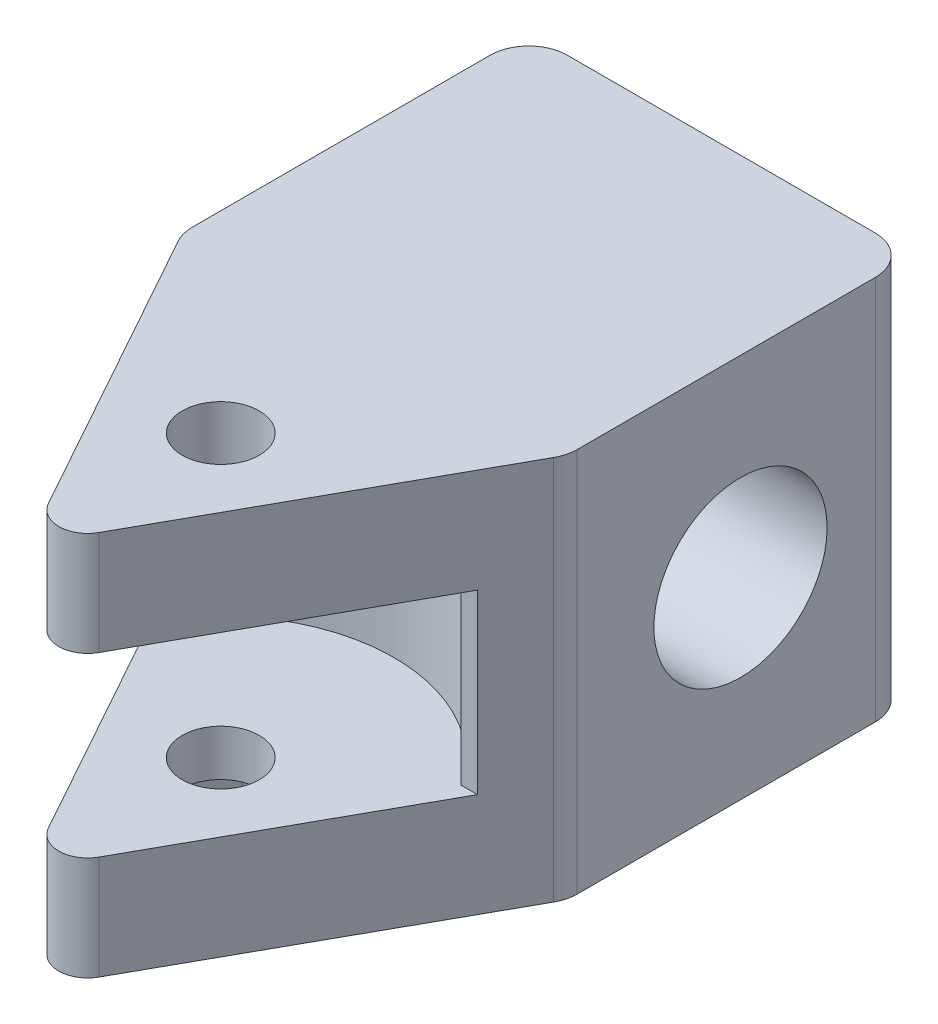
ISO-10303-21;
HEADER;
FILE_DESCRIPTION(('STEP AP214'),'2;1');
FILE_NAME('part.step','',(''),(''),'','','');
FILE_SCHEMA(('AUTOMOTIVE_DESIGN { 1 0 10303 214 1 1 1 1 }'));
ENDSEC;
DATA;
#1=APPLICATION_CONTEXT('core data for automotive mechanical design processes');
#2=APPLICATION_PROTOCOL_DEFINITION('international standard','automotive_design',2000,#1);
#3=PRODUCT_CONTEXT('',#1,'mechanical');
#4=PRODUCT('Part','Part','',(#3));
#5=PRODUCT_RELATED_PRODUCT_CATEGORY('part','',(#4));
#6=PRODUCT_DEFINITION_FORMATION('','',#4);
#7=PRODUCT_DEFINITION_CONTEXT('part definition',#1,'design');
#8=PRODUCT_DEFINITION('design','',#6,#7);
#9=PRODUCT_DEFINITION_SHAPE('','',#8);
#10=(LENGTH_UNIT() NAMED_UNIT(*) SI_UNIT(.MILLI.,.METRE.));
#11=(NAMED_UNIT(*) PLANE_ANGLE_UNIT() SI_UNIT($,.RADIAN.));
#12=(NAMED_UNIT(*) SI_UNIT($,.STERADIAN.) SOLID_ANGLE_UNIT());
#13=UNCERTAINTY_MEASURE_WITH_UNIT(LENGTH_MEASURE(1.E-05),#10,'distance_accuracy_value','');
#14=(GEOMETRIC_REPRESENTATION_CONTEXT(3) GLOBAL_UNCERTAINTY_ASSIGNED_CONTEXT((#13)) GLOBAL_UNIT_ASSIGNED_CONTEXT((#10,
#11,#12)) REPRESENTATION_CONTEXT('',''));
#15=CARTESIAN_POINT('',(0.,0.,0.));
#16=DIRECTION('',(0.,0.,1.));
#17=DIRECTION('',(1.,0.,0.));
#18=AXIS2_PLACEMENT_3D('',#15,#16,#17);
#19=CARTESIAN_POINT('',(0.,10.,17.));
#20=DIRECTION('',(0.,-1.,0.));
#21=DIRECTION('',(0.,0.,-1.));
#22=AXIS2_PLACEMENT_3D('',#19,#20,#21);
#23=CYLINDRICAL_SURFACE('',#22,2.);
#24=CARTESIAN_POINT('',(0.,-4.6,17.));
#25=DIRECTION('',(0.,-1.,0.));
#26=DIRECTION('',(0.,0.,-1.));
#27=AXIS2_PLACEMENT_3D('',#24,#25,#26);
#28=CIRCLE('',#27,2.);
#29=CARTESIAN_POINT('',(0.,-4.6,15.));
#30=VERTEX_POINT('',#29);
#31=EDGE_CURVE('E340',#30,#30,#28,.T.);
#32=ORIENTED_EDGE('',*,*,#31,.F.);
#33=EDGE_LOOP('',(#32));
#34=FACE_BOUND('',#33,.T.);
#35=CARTESIAN_POINT('',(0.,-7.,17.));
#36=DIRECTION('',(0.,-1.,0.));
#37=DIRECTION('',(0.,0.,-1.));
#38=AXIS2_PLACEMENT_3D('',#35,#36,#37);
#39=CIRCLE('',#38,2.);
#40=CARTESIAN_POINT('',(0.,-7.,15.));
#41=VERTEX_POINT('',#40);
#42=EDGE_CURVE('E41',#41,#41,#39,.T.);
#43=ORIENTED_EDGE('',*,*,#42,.T.);
#44=EDGE_LOOP('',(#43));
#45=FACE_BOUND('',#44,.T.);
#46=ADVANCED_FACE('F37',(#34,#45),#23,.F.);
#47=CARTESIAN_POINT('',(-10.,-4.6,12.));
#48=DIRECTION('',(0.,0.,-1.));
#49=DIRECTION('',(0.,1.,0.));
#50=AXIS2_PLACEMENT_3D('',#47,#48,#49);
#51=PLANE('',#50);
#52=DIRECTION('',(1.,0.,0.));
#53=VECTOR('',#52,1.);
#54=CARTESIAN_POINT('',(-10.,-4.6,12.));
#55=LINE('',#54,#53);
#56=CARTESIAN_POINT('',(-8.33333333333333,-4.6,12.));
#57=VERTEX_POINT('',#56);
#58=CARTESIAN_POINT('',(-7.48331477354788,-4.6,12.));
#59=VERTEX_POINT('',#58);
#60=EDGE_CURVE('E342',#57,#59,#55,.T.);
#61=ORIENTED_EDGE('',*,*,#60,.T.);
#62=DIRECTION('',(0.,1.,0.));
#63=VECTOR('',#62,1.);
#64=CARTESIAN_POINT('',(-7.48331477354788,-30.0558441227157,12.));
#65=LINE('',#64,#63);
#66=CARTESIAN_POINT('',(-7.48331477354788,4.6,12.));
#67=VERTEX_POINT('',#66);
#68=EDGE_CURVE('E328',#59,#67,#65,.T.);
#69=ORIENTED_EDGE('',*,*,#68,.T.);
#70=DIRECTION('',(1.,0.,0.));
#71=VECTOR('',#70,1.);
#72=CARTESIAN_POINT('',(-10.,4.6,12.));
#73=LINE('',#72,#71);
#74=CARTESIAN_POINT('',(-8.33333333333333,4.6,12.));
#75=VERTEX_POINT('',#74);
#76=EDGE_CURVE('E338',#75,#67,#73,.T.);
#77=ORIENTED_EDGE('',*,*,#76,.F.);
#78=DIRECTION('',(0.,1.,0.));
#79=VECTOR('',#78,1.);
#80=CARTESIAN_POINT('',(-8.33333333333333,10.,12.));
#81=LINE('',#80,#79);
#82=EDGE_CURVE('E354',#57,#75,#81,.T.);
#83=ORIENTED_EDGE('',*,*,#82,.F.);
#84=EDGE_LOOP('',(#61,#69,#77,#83));
#85=FACE_BOUND('',#84,.T.);
#86=ADVANCED_FACE('F474',(#85),#51,.F.);
#87=CARTESIAN_POINT('',(0.,4.6,17.));
#88=DIRECTION('',(0.,1.,0.));
#89=DIRECTION('',(0.,0.,1.));
#90=AXIS2_PLACEMENT_3D('',#87,#88,#89);
#91=CIRCLE('',#90,2.);
#92=CARTESIAN_POINT('',(0.,4.6,19.));
#93=VERTEX_POINT('',#92);
#94=EDGE_CURVE('E349',#93,#93,#91,.T.);
#95=ORIENTED_EDGE('',*,*,#94,.F.);
#96=EDGE_LOOP('',(#95));
#97=FACE_BOUND('',#96,.T.);
#98=CARTESIAN_POINT('',(0.,10.,17.));
#99=DIRECTION('',(0.,1.,0.));
#100=DIRECTION('',(0.,0.,1.));
#101=AXIS2_PLACEMENT_3D('',#98,#99,#100);
#102=CIRCLE('',#101,2.);
#103=CARTESIAN_POINT('',(0.,10.,19.));
#104=VERTEX_POINT('',#103);
#105=EDGE_CURVE('E373',#104,#104,#102,.T.);
#106=ORIENTED_EDGE('',*,*,#105,.T.);
#107=EDGE_LOOP('',(#106));
#108=FACE_BOUND('',#107,.T.);
#109=ADVANCED_FACE('F527',(#97,#108),#23,.F.);
#110=CARTESIAN_POINT('',(10.,10.,0.));
#111=DIRECTION('',(1.,0.,0.));
#112=DIRECTION('',(0.,0.,-1.));
#113=AXIS2_PLACEMENT_3D('',#110,#111,#112);
#114=PLANE('',#113);
#115=CARTESIAN_POINT('',(10.,0.,0.));
#116=DIRECTION('',(1.,0.,0.));
#117=DIRECTION('',(0.,0.,-1.));
#118=AXIS2_PLACEMENT_3D('',#115,#116,#117);
#119=CIRCLE('',#118,4.5);
#120=CARTESIAN_POINT('',(10.,0.,-4.5));
#121=VERTEX_POINT('',#120);
#122=EDGE_CURVE('E331',#121,#121,#119,.T.);
#123=ORIENTED_EDGE('',*,*,#122,.F.);
#124=EDGE_LOOP('',(#123));
#125=FACE_BOUND('',#124,.T.);
#126=DIRECTION('',(0.,0.,1.));
#127=VECTOR('',#126,1.);
#128=CARTESIAN_POINT('',(10.,-10.,0.));
#129=LINE('',#128,#127);
#130=CARTESIAN_POINT('',(10.,-10.,-7.));
#131=VERTEX_POINT('',#130);
#132=CARTESIAN_POINT('',(10.,-10.,8.4817479436052));
#133=VERTEX_POINT('',#132);
#134=EDGE_CURVE('E357',#131,#133,#129,.T.);
#135=ORIENTED_EDGE('',*,*,#134,.F.);
#136=DIRECTION('',(0.,-1.,0.));
#137=VECTOR('',#136,1.);
#138=CARTESIAN_POINT('',(10.,10.,-7.));
#139=LINE('',#138,#137);
#140=CARTESIAN_POINT('',(10.,10.,-7.));
#141=VERTEX_POINT('',#140);
#142=EDGE_CURVE('E433',#131,#141,#139,.F.);
#143=ORIENTED_EDGE('',*,*,#142,.T.);
#144=DIRECTION('',(0.,0.,1.));
#145=VECTOR('',#144,1.);
#146=CARTESIAN_POINT('',(10.,10.,0.));
#147=LINE('',#146,#145);
#148=CARTESIAN_POINT('',(10.,10.,8.4817479436052));
#149=VERTEX_POINT('',#148);
#150=EDGE_CURVE('E358',#141,#149,#147,.T.);
#151=ORIENTED_EDGE('',*,*,#150,.T.);
#152=DIRECTION('',(0.,-1.,0.));
#153=VECTOR('',#152,1.);
#154=CARTESIAN_POINT('',(10.,-10.,8.4817479436052));
#155=LINE('',#154,#153);
#156=EDGE_CURVE('E430',#149,#133,#155,.T.);
#157=ORIENTED_EDGE('',*,*,#156,.T.);
#158=EDGE_LOOP('',(#135,#143,#151,#157));
#159=FACE_BOUND('',#158,.T.);
#160=ADVANCED_FACE('F498',(#125,#159),#114,.T.);
#161=CARTESIAN_POINT('',(0.,10.,-9.));
#162=DIRECTION('',(0.,0.,-1.));
#163=DIRECTION('',(-1.,0.,0.));
#164=AXIS2_PLACEMENT_3D('',#161,#162,#163);
#165=PLANE('',#164);
#166=DIRECTION('',(1.,0.,0.));
#167=VECTOR('',#166,1.);
#168=CARTESIAN_POINT('',(0.,10.,-9.));
#169=LINE('',#168,#167);
#170=CARTESIAN_POINT('',(-8.,10.,-9.));
#171=VERTEX_POINT('',#170);
#172=CARTESIAN_POINT('',(8.,10.,-9.));
#173=VERTEX_POINT('',#172);
#174=EDGE_CURVE('E361',#171,#173,#169,.T.);
#175=ORIENTED_EDGE('',*,*,#174,.T.);
#176=DIRECTION('',(0.,-1.,0.));
#177=VECTOR('',#176,1.);
#178=CARTESIAN_POINT('',(8.,10.,-9.));
#179=LINE('',#178,#177);
#180=CARTESIAN_POINT('',(8.,-10.,-9.));
#181=VERTEX_POINT('',#180);
#182=EDGE_CURVE('E419',#173,#181,#179,.T.);
#183=ORIENTED_EDGE('',*,*,#182,.T.);
#184=DIRECTION('',(1.,0.,0.));
#185=VECTOR('',#184,1.);
#186=CARTESIAN_POINT('',(0.,-10.,-9.));
#187=LINE('',#186,#185);
#188=CARTESIAN_POINT('',(-8.,-10.,-9.));
#189=VERTEX_POINT('',#188);
#190=EDGE_CURVE('E379',#189,#181,#187,.T.);
#191=ORIENTED_EDGE('',*,*,#190,.F.);
#192=DIRECTION('',(0.,-1.,0.));
#193=VECTOR('',#192,1.);
#194=CARTESIAN_POINT('',(-8.,10.,-9.));
#195=LINE('',#194,#193);
#196=EDGE_CURVE('E417',#189,#171,#195,.F.);
#197=ORIENTED_EDGE('',*,*,#196,.T.);
#198=EDGE_LOOP('',(#175,#183,#191,#197));
#199=FACE_BOUND('',#198,.T.);
#200=ADVANCED_FACE('F506',(#199),#165,.T.);
#201=CARTESIAN_POINT('',(-10.,10.,0.));
#202=DIRECTION('',(1.,0.,0.));
#203=DIRECTION('',(0.,0.,-1.));
#204=AXIS2_PLACEMENT_3D('',#201,#202,#203);
#205=PLANE('',#204);
#206=CARTESIAN_POINT('',(-10.,0.,0.));
#207=DIRECTION('',(1.,0.,0.));
#208=DIRECTION('',(0.,0.,-1.));
#209=AXIS2_PLACEMENT_3D('',#206,#207,#208);
#210=CIRCLE('',#209,4.5);
#211=CARTESIAN_POINT('',(-10.,0.,-4.5));
#212=VERTEX_POINT('',#211);
#213=EDGE_CURVE('E334',#212,#212,#210,.F.);
#214=ORIENTED_EDGE('',*,*,#213,.F.);
#215=EDGE_LOOP('',(#214));
#216=FACE_BOUND('',#215,.T.);
#217=DIRECTION('',(0.,0.,1.));
#218=VECTOR('',#217,1.);
#219=CARTESIAN_POINT('',(-10.,10.,0.));
#220=LINE('',#219,#218);
#221=CARTESIAN_POINT('',(-10.,10.,-7.));
#222=VERTEX_POINT('',#221);
#223=CARTESIAN_POINT('',(-10.,10.,8.4817479436052));
#224=VERTEX_POINT('',#223);
#225=EDGE_CURVE('E365',#222,#224,#220,.T.);
#226=ORIENTED_EDGE('',*,*,#225,.F.);
#227=DIRECTION('',(0.,-1.,0.));
#228=VECTOR('',#227,1.);
#229=CARTESIAN_POINT('',(-10.,-10.,-7.));
#230=LINE('',#229,#228);
#231=CARTESIAN_POINT('',(-10.,-10.,-7.));
#232=VERTEX_POINT('',#231);
#233=EDGE_CURVE('E445',#222,#232,#230,.T.);
#234=ORIENTED_EDGE('',*,*,#233,.T.);
#235=DIRECTION('',(0.,0.,1.));
#236=VECTOR('',#235,1.);
#237=CARTESIAN_POINT('',(-10.,-10.,0.));
#238=LINE('',#237,#236);
#239=CARTESIAN_POINT('',(-10.,-10.,8.4817479436052));
#240=VERTEX_POINT('',#239);
#241=EDGE_CURVE('E382',#232,#240,#238,.T.);
#242=ORIENTED_EDGE('',*,*,#241,.T.);
#243=DIRECTION('',(0.,-1.,0.));
#244=VECTOR('',#243,1.);
#245=CARTESIAN_POINT('',(-10.,10.,8.4817479436052));
#246=LINE('',#245,#244);
#247=EDGE_CURVE('E443',#240,#224,#246,.F.);
#248=ORIENTED_EDGE('',*,*,#247,.T.);
#249=EDGE_LOOP('',(#226,#234,#242,#248));
#250=FACE_BOUND('',#249,.T.);
#251=ADVANCED_FACE('F514',(#216,#250),#205,.F.);
#252=CARTESIAN_POINT('',(-11.4622641509434,10.,6.36792452830189));
#253=DIRECTION('',(0.874157276121538,0.,-0.485642931178632));
#254=DIRECTION('',(-0.485642931178632,0.,-0.874157276121538));
#255=AXIS2_PLACEMENT_3D('',#252,#253,#254);
#256=PLANE('',#255);
#257=DIRECTION('',(0.485642931178632,0.,0.874157276121538));
#258=VECTOR('',#257,1.);
#259=CARTESIAN_POINT('',(-11.4622641509434,10.,6.36792452830189));
#260=LINE('',#259,#258);
#261=CARTESIAN_POINT('',(-9.74831455224307,10.,9.45303380596246));
#262=VERTEX_POINT('',#261);
#263=CARTESIAN_POINT('',(-1.31123591418231,10.,24.6397753544718));
#264=VERTEX_POINT('',#263);
#265=EDGE_CURVE('E368',#262,#264,#260,.T.);
#266=ORIENTED_EDGE('',*,*,#265,.F.);
#267=DIRECTION('',(0.,-1.,0.));
#268=VECTOR('',#267,1.);
#269=CARTESIAN_POINT('',(-9.74831455224307,10.,9.45303380596246));
#270=LINE('',#269,#268);
#271=CARTESIAN_POINT('',(-9.74831455224307,-10.,9.45303380596246));
#272=VERTEX_POINT('',#271);
#273=EDGE_CURVE('E46',#262,#272,#270,.T.);
#274=ORIENTED_EDGE('',*,*,#273,.T.);
#275=DIRECTION('',(0.485642931178632,0.,0.874157276121538));
#276=VECTOR('',#275,1.);
#277=CARTESIAN_POINT('',(-11.4622641509434,-10.,6.36792452830189));
#278=LINE('',#277,#276);
#279=CARTESIAN_POINT('',(-1.31123591418231,-10.,24.6397753544718));
#280=VERTEX_POINT('',#279);
#281=EDGE_CURVE('E385',#272,#280,#278,.T.);
#282=ORIENTED_EDGE('',*,*,#281,.T.);
#283=DIRECTION('',(0.,-1.,0.));
#284=VECTOR('',#283,1.);
#285=CARTESIAN_POINT('',(-1.31123591418231,10.,24.6397753544718));
#286=LINE('',#285,#284);
#287=CARTESIAN_POINT('',(-1.31123591418231,-4.6,24.6397753544718));
#288=VERTEX_POINT('',#287);
#289=EDGE_CURVE('E407',#280,#288,#286,.F.);
#290=ORIENTED_EDGE('',*,*,#289,.T.);
#291=DIRECTION('',(-0.485642931178632,0.,-0.874157276121538));
#292=VECTOR('',#291,1.);
#293=CARTESIAN_POINT('',(-11.4622641509434,-4.6,6.36792452830189));
#294=LINE('',#293,#292);
#295=EDGE_CURVE('E347',#288,#57,#294,.T.);
#296=ORIENTED_EDGE('',*,*,#295,.T.);
#297=ORIENTED_EDGE('',*,*,#82,.T.);
#298=DIRECTION('',(0.485642931178632,0.,0.874157276121538));
#299=VECTOR('',#298,1.);
#300=CARTESIAN_POINT('',(-11.4622641509434,4.6,6.36792452830189));
#301=LINE('',#300,#299);
#302=CARTESIAN_POINT('',(-1.31123591418231,4.6,24.6397753544718));
#303=VERTEX_POINT('',#302);
#304=EDGE_CURVE('E352',#75,#303,#301,.T.);
#305=ORIENTED_EDGE('',*,*,#304,.T.);
#306=DIRECTION('',(0.,-1.,0.));
#307=VECTOR('',#306,1.);
#308=CARTESIAN_POINT('',(-1.31123591418231,10.,24.6397753544718));
#309=LINE('',#308,#307);
#310=EDGE_CURVE('E404',#303,#264,#309,.F.);
#311=ORIENTED_EDGE('',*,*,#310,.T.);
#312=EDGE_LOOP('',(#266,#274,#282,#290,#296,#297,#305,#311));
#313=FACE_BOUND('',#312,.T.);
#314=ADVANCED_FACE('F453',(#313),#256,.F.);
#315=CARTESIAN_POINT('',(11.4622641509434,10.,6.36792452830189));
#316=DIRECTION('',(-0.874157276121538,0.,-0.485642931178632));
#317=DIRECTION('',(-0.485642931178632,0.,0.874157276121538));
#318=AXIS2_PLACEMENT_3D('',#315,#316,#317);
#319=PLANE('',#318);
#320=DIRECTION('',(0.485642931178632,0.,-0.874157276121538));
#321=VECTOR('',#320,1.);
#322=CARTESIAN_POINT('',(11.4622641509434,-10.,6.36792452830189));
#323=LINE('',#322,#321);
#324=CARTESIAN_POINT('',(1.31123591418231,-10.,24.6397753544718));
#325=VERTEX_POINT('',#324);
#326=CARTESIAN_POINT('',(9.74831455224307,-10.,9.45303380596246));
#327=VERTEX_POINT('',#326);
#328=EDGE_CURVE('E362',#325,#327,#323,.T.);
#329=ORIENTED_EDGE('',*,*,#328,.T.);
#330=DIRECTION('',(0.,-1.,0.));
#331=VECTOR('',#330,1.);
#332=CARTESIAN_POINT('',(9.74831455224307,10.,9.45303380596246));
#333=LINE('',#332,#331);
#334=CARTESIAN_POINT('',(9.74831455224307,10.,9.45303380596246));
#335=VERTEX_POINT('',#334);
#336=EDGE_CURVE('E11',#327,#335,#333,.F.);
#337=ORIENTED_EDGE('',*,*,#336,.T.);
#338=DIRECTION('',(0.485642931178632,0.,-0.874157276121538));
#339=VECTOR('',#338,1.);
#340=CARTESIAN_POINT('',(11.4622641509434,10.,6.36792452830189));
#341=LINE('',#340,#339);
#342=CARTESIAN_POINT('',(1.31123591418231,10.,24.6397753544718));
#343=VERTEX_POINT('',#342);
#344=EDGE_CURVE('E370',#343,#335,#341,.T.);
#345=ORIENTED_EDGE('',*,*,#344,.F.);
#346=DIRECTION('',(0.,-1.,0.));
#347=VECTOR('',#346,1.);
#348=CARTESIAN_POINT('',(1.31123591418231,10.,24.6397753544718));
#349=LINE('',#348,#347);
#350=CARTESIAN_POINT('',(1.31123591418231,4.6,24.6397753544718));
#351=VERTEX_POINT('',#350);
#352=EDGE_CURVE('E395',#343,#351,#349,.T.);
#353=ORIENTED_EDGE('',*,*,#352,.T.);
#354=DIRECTION('',(0.485642931178632,0.,-0.874157276121538));
#355=VECTOR('',#354,1.);
#356=CARTESIAN_POINT('',(11.4622641509434,4.6,6.36792452830189));
#357=LINE('',#356,#355);
#358=CARTESIAN_POINT('',(8.33333333333333,4.6,12.));
#359=VERTEX_POINT('',#358);
#360=EDGE_CURVE('E350',#351,#359,#357,.T.);
#361=ORIENTED_EDGE('',*,*,#360,.T.);
#362=DIRECTION('',(0.,-1.,0.));
#363=VECTOR('',#362,1.);
#364=CARTESIAN_POINT('',(8.33333333333333,10.,12.));
#365=LINE('',#364,#363);
#366=CARTESIAN_POINT('',(8.33333333333333,-4.6,12.));
#367=VERTEX_POINT('',#366);
#368=EDGE_CURVE('E376',#359,#367,#365,.T.);
#369=ORIENTED_EDGE('',*,*,#368,.T.);
#370=DIRECTION('',(-0.485642931178632,0.,0.874157276121538));
#371=VECTOR('',#370,1.);
#372=CARTESIAN_POINT('',(11.4622641509434,-4.6,6.36792452830189));
#373=LINE('',#372,#371);
#374=CARTESIAN_POINT('',(1.31123591418231,-4.6,24.6397753544718));
#375=VERTEX_POINT('',#374);
#376=EDGE_CURVE('E345',#367,#375,#373,.T.);
#377=ORIENTED_EDGE('',*,*,#376,.T.);
#378=DIRECTION('',(0.,-1.,0.));
#379=VECTOR('',#378,1.);
#380=CARTESIAN_POINT('',(1.31123591418231,10.,24.6397753544718));
#381=LINE('',#380,#379);
#382=EDGE_CURVE('E398',#375,#325,#381,.T.);
#383=ORIENTED_EDGE('',*,*,#382,.T.);
#384=EDGE_LOOP('',(#329,#337,#345,#353,#361,#369,#377,#383));
#385=FACE_BOUND('',#384,.T.);
#386=ADVANCED_FACE('F491',(#385),#319,.F.);
#387=CARTESIAN_POINT('',(0.,10.,0.));
#388=DIRECTION('',(0.,1.,0.));
#389=DIRECTION('',(0.,0.,1.));
#390=AXIS2_PLACEMENT_3D('',#387,#388,#389);
#391=PLANE('',#390);
#392=ORIENTED_EDGE('',*,*,#150,.F.);
#393=CARTESIAN_POINT('',(8.,10.,-7.));
#394=DIRECTION('',(0.,1.,0.));
#395=DIRECTION('',(0.,0.,1.));
#396=AXIS2_PLACEMENT_3D('',#393,#394,#395);
#397=CIRCLE('',#396,2.);
#398=EDGE_CURVE('E441',#141,#173,#397,.T.);
#399=ORIENTED_EDGE('',*,*,#398,.T.);
#400=ORIENTED_EDGE('',*,*,#174,.F.);
#401=CARTESIAN_POINT('',(-8.,10.,-7.));
#402=DIRECTION('',(0.,1.,0.));
#403=DIRECTION('',(0.,0.,1.));
#404=AXIS2_PLACEMENT_3D('',#401,#402,#403);
#405=CIRCLE('',#404,2.);
#406=EDGE_CURVE('E439',#171,#222,#405,.T.);
#407=ORIENTED_EDGE('',*,*,#406,.T.);
#408=ORIENTED_EDGE('',*,*,#225,.T.);
#409=CARTESIAN_POINT('',(-8.,10.,8.4817479436052));
#410=DIRECTION('',(0.,1.,0.));
#411=DIRECTION('',(0.,0.,1.));
#412=AXIS2_PLACEMENT_3D('',#409,#410,#411);
#413=CIRCLE('',#412,2.);
#414=EDGE_CURVE('E437',#224,#262,#413,.T.);
#415=ORIENTED_EDGE('',*,*,#414,.T.);
#416=ORIENTED_EDGE('',*,*,#265,.T.);
#417=CARTESIAN_POINT('',(0.,10.,23.9113109577039));
#418=DIRECTION('',(0.,1.,0.));
#419=DIRECTION('',(0.,0.,1.));
#420=AXIS2_PLACEMENT_3D('',#417,#418,#419);
#421=CIRCLE('',#420,1.5);
#422=EDGE_CURVE('E415',#264,#343,#421,.T.);
#423=ORIENTED_EDGE('',*,*,#422,.T.);
#424=ORIENTED_EDGE('',*,*,#344,.T.);
#425=CARTESIAN_POINT('',(8.,10.,8.4817479436052));
#426=DIRECTION('',(0.,1.,0.));
#427=DIRECTION('',(0.,0.,1.));
#428=AXIS2_PLACEMENT_3D('',#425,#426,#427);
#429=CIRCLE('',#428,2.);
#430=EDGE_CURVE('E435',#335,#149,#429,.T.);
#431=ORIENTED_EDGE('',*,*,#430,.T.);
#432=EDGE_LOOP('',(#392,#399,#400,#407,#408,#415,#416,#423,#424,#431));
#433=FACE_BOUND('',#432,.T.);
#434=ORIENTED_EDGE('',*,*,#105,.F.);
#435=EDGE_LOOP('',(#434));
#436=FACE_BOUND('',#435,.T.);
#437=ADVANCED_FACE('F487',(#433,#436),#391,.T.);
#438=CARTESIAN_POINT('',(0.,-10.,0.));
#439=DIRECTION('',(0.,1.,0.));
#440=DIRECTION('',(0.,0.,1.));
#441=AXIS2_PLACEMENT_3D('',#438,#439,#440);
#442=PLANE('',#441);
#443=DIRECTION('',(0.500000000000004,0.,0.866025403784436));
#444=VECTOR('',#443,1.);
#445=CARTESIAN_POINT('',(3.1003709455483,-10.,15.2099999999998));
#446=LINE('',#445,#444);
#447=CARTESIAN_POINT('',(2.20547802830527,-10.,13.6600000000014));
#448=VERTEX_POINT('',#447);
#449=CARTESIAN_POINT('',(3.99526386279223,-10.,16.7599999999998));
#450=VERTEX_POINT('',#449);
#451=EDGE_CURVE('E272',#448,#450,#446,.T.);
#452=ORIENTED_EDGE('',*,*,#451,.F.);
#453=CARTESIAN_POINT('',(1.78978583448785,-10.,13.8999999999998));
#454=DIRECTION('',(0.,-1.,0.));
#455=DIRECTION('',(0.,0.,-1.));
#456=AXIS2_PLACEMENT_3D('',#453,#454,#455);
#457=CIRCLE('',#456,0.480000000000001);
#458=CARTESIAN_POINT('',(1.78978583448786,-10.,13.4199999999998));
#459=VERTEX_POINT('',#458);
#460=EDGE_CURVE('E53',#459,#448,#457,.T.);
#461=ORIENTED_EDGE('',*,*,#460,.F.);
#462=DIRECTION('',(1.,0.,0.));
#463=VECTOR('',#462,1.);
#464=CARTESIAN_POINT('',(0.,-10.,13.4199999999998));
#465=LINE('',#464,#463);
#466=CARTESIAN_POINT('',(-1.78978583448783,-10.,13.4199999999998));
#467=VERTEX_POINT('',#466);
#468=EDGE_CURVE('E244',#467,#459,#465,.T.);
#469=ORIENTED_EDGE('',*,*,#468,.F.);
#470=CARTESIAN_POINT('',(-1.78978583448783,-10.,13.8999999999998));
#471=DIRECTION('',(0.,-1.,0.));
#472=DIRECTION('',(0.,0.,-1.));
#473=AXIS2_PLACEMENT_3D('',#470,#471,#472);
#474=CIRCLE('',#473,0.48);
#475=CARTESIAN_POINT('',(-2.20547802830434,-10.,13.6599999999998));
#476=VERTEX_POINT('',#475);
#477=EDGE_CURVE('E247',#476,#467,#474,.T.);
#478=ORIENTED_EDGE('',*,*,#477,.F.);
#479=DIRECTION('',(0.499999999999999,0.,-0.866025403784439));
#480=VECTOR('',#479,1.);
#481=CARTESIAN_POINT('',(-3.10037094554828,-10.,15.2099999999998));
#482=LINE('',#481,#480);
#483=CARTESIAN_POINT('',(-3.99526386279223,-10.,16.7599999999998));
#484=VERTEX_POINT('',#483);
#485=EDGE_CURVE('E295',#484,#476,#482,.T.);
#486=ORIENTED_EDGE('',*,*,#485,.F.);
#487=CARTESIAN_POINT('',(-3.57957166897567,-10.,16.9999999999998));
#488=DIRECTION('',(0.,-1.,0.));
#489=DIRECTION('',(0.,0.,-1.));
#490=AXIS2_PLACEMENT_3D('',#487,#488,#489);
#491=CIRCLE('',#490,0.480000000000002);
#492=CARTESIAN_POINT('',(-3.9952638627922,-10.,17.2399999999998));
#493=VERTEX_POINT('',#492);
#494=EDGE_CURVE('E292',#493,#484,#491,.T.);
#495=ORIENTED_EDGE('',*,*,#494,.F.);
#496=DIRECTION('',(-0.500000000000003,0.,-0.866025403784437));
#497=VECTOR('',#496,1.);
#498=CARTESIAN_POINT('',(-3.10037094554828,-10.,18.7899999999998));
#499=LINE('',#498,#497);
#500=CARTESIAN_POINT('',(-2.20547802830544,-10.,20.3399999999979));
#501=VERTEX_POINT('',#500);
#502=EDGE_CURVE('E289',#501,#493,#499,.T.);
#503=ORIENTED_EDGE('',*,*,#502,.F.);
#504=CARTESIAN_POINT('',(-1.78978583448783,-10.,20.0999999999998));
#505=DIRECTION('',(0.,-1.,0.));
#506=DIRECTION('',(0.,0.,-1.));
#507=AXIS2_PLACEMENT_3D('',#504,#505,#506);
#508=CIRCLE('',#507,0.480000000000001);
#509=CARTESIAN_POINT('',(-1.78978583448783,-10.,20.5799999999998));
#510=VERTEX_POINT('',#509);
#511=EDGE_CURVE('E286',#510,#501,#508,.T.);
#512=ORIENTED_EDGE('',*,*,#511,.F.);
#513=DIRECTION('',(-1.,0.,0.));
#514=VECTOR('',#513,1.);
#515=CARTESIAN_POINT('',(0.,-10.,20.5799999999998));
#516=LINE('',#515,#514);
#517=CARTESIAN_POINT('',(1.7897858344857,-10.,20.5799999999998));
#518=VERTEX_POINT('',#517);
#519=EDGE_CURVE('E283',#518,#510,#516,.T.);
#520=ORIENTED_EDGE('',*,*,#519,.F.);
#521=CARTESIAN_POINT('',(1.78978583448786,-10.,20.0999999999998));
#522=DIRECTION('',(0.,-1.,0.));
#523=DIRECTION('',(0.,0.,-1.));
#524=AXIS2_PLACEMENT_3D('',#521,#522,#523);
#525=CIRCLE('',#524,0.480000000000001);
#526=CARTESIAN_POINT('',(2.20547802830436,-10.,20.3399999999998));
#527=VERTEX_POINT('',#526);
#528=EDGE_CURVE('E280',#527,#518,#525,.T.);
#529=ORIENTED_EDGE('',*,*,#528,.F.);
#530=DIRECTION('',(-0.499999999999996,0.,0.866025403784441));
#531=VECTOR('',#530,1.);
#532=CARTESIAN_POINT('',(3.1003709455483,-10.,18.7899999999998));
#533=LINE('',#532,#531);
#534=CARTESIAN_POINT('',(3.99526386279026,-10.,17.2400000000032));
#535=VERTEX_POINT('',#534);
#536=EDGE_CURVE('E277',#535,#527,#533,.T.);
#537=ORIENTED_EDGE('',*,*,#536,.F.);
#538=CARTESIAN_POINT('',(3.5795716689757,-10.,16.9999999999998));
#539=DIRECTION('',(0.,-1.,0.));
#540=DIRECTION('',(0.,0.,-1.));
#541=AXIS2_PLACEMENT_3D('',#538,#539,#540);
#542=CIRCLE('',#541,0.48);
#543=EDGE_CURVE('E274',#450,#535,#542,.T.);
#544=ORIENTED_EDGE('',*,*,#543,.F.);
#545=EDGE_LOOP('',(#452,#461,#469,#478,#486,#495,#503,#512,#520,#529,#537,#544));
#546=FACE_BOUND('',#545,.T.);
#547=ORIENTED_EDGE('',*,*,#190,.T.);
#548=CARTESIAN_POINT('',(8.,-10.,-7.));
#549=DIRECTION('',(0.,1.,0.));
#550=DIRECTION('',(0.,0.,1.));
#551=AXIS2_PLACEMENT_3D('',#548,#549,#550);
#552=CIRCLE('',#551,2.);
#553=EDGE_CURVE('E428',#181,#131,#552,.F.);
#554=ORIENTED_EDGE('',*,*,#553,.T.);
#555=ORIENTED_EDGE('',*,*,#134,.T.);
#556=CARTESIAN_POINT('',(8.,-10.,8.4817479436052));
#557=DIRECTION('',(0.,1.,0.));
#558=DIRECTION('',(0.,0.,1.));
#559=AXIS2_PLACEMENT_3D('',#556,#557,#558);
#560=CIRCLE('',#559,2.);
#561=EDGE_CURVE('E422',#133,#327,#560,.F.);
#562=ORIENTED_EDGE('',*,*,#561,.T.);
#563=ORIENTED_EDGE('',*,*,#328,.F.);
#564=CARTESIAN_POINT('',(0.,-10.,23.9113109577039));
#565=DIRECTION('',(0.,1.,0.));
#566=DIRECTION('',(0.,0.,1.));
#567=AXIS2_PLACEMENT_3D('',#564,#565,#566);
#568=CIRCLE('',#567,1.5);
#569=EDGE_CURVE('E401',#325,#280,#568,.F.);
#570=ORIENTED_EDGE('',*,*,#569,.T.);
#571=ORIENTED_EDGE('',*,*,#281,.F.);
#572=CARTESIAN_POINT('',(-8.,-10.,8.4817479436052));
#573=DIRECTION('',(0.,1.,0.));
#574=DIRECTION('',(0.,0.,1.));
#575=AXIS2_PLACEMENT_3D('',#572,#573,#574);
#576=CIRCLE('',#575,2.);
#577=EDGE_CURVE('E424',#272,#240,#576,.F.);
#578=ORIENTED_EDGE('',*,*,#577,.T.);
#579=ORIENTED_EDGE('',*,*,#241,.F.);
#580=CARTESIAN_POINT('',(-8.,-10.,-7.));
#581=DIRECTION('',(0.,1.,0.));
#582=DIRECTION('',(0.,0.,1.));
#583=AXIS2_PLACEMENT_3D('',#580,#581,#582);
#584=CIRCLE('',#583,2.);
#585=EDGE_CURVE('E426',#232,#189,#584,.F.);
#586=ORIENTED_EDGE('',*,*,#585,.T.);
#587=EDGE_LOOP('',(#547,#554,#555,#562,#563,#570,#571,#578,#579,#586));
#588=FACE_BOUND('',#587,.T.);
#589=ADVANCED_FACE('F457',(#546,#588),#442,.F.);
#590=CARTESIAN_POINT('',(7.48331477354788,4.6,12.));
#591=VERTEX_POINT('',#590);
#592=EDGE_CURVE('E341',#591,#359,#73,.T.);
#593=ORIENTED_EDGE('',*,*,#592,.F.);
#594=DIRECTION('',(0.,1.,0.));
#595=VECTOR('',#594,1.);
#596=CARTESIAN_POINT('',(7.48331477354788,-30.0558441227157,12.));
#597=LINE('',#596,#595);
#598=CARTESIAN_POINT('',(7.48331477354788,-4.6,12.));
#599=VERTEX_POINT('',#598);
#600=EDGE_CURVE('E325',#591,#599,#597,.F.);
#601=ORIENTED_EDGE('',*,*,#600,.T.);
#602=EDGE_CURVE('E337',#599,#367,#55,.T.);
#603=ORIENTED_EDGE('',*,*,#602,.T.);
#604=ORIENTED_EDGE('',*,*,#368,.F.);
#605=EDGE_LOOP('',(#593,#601,#603,#604));
#606=FACE_BOUND('',#605,.T.);
#607=ADVANCED_FACE('F534',(#606),#51,.F.);
#608=CARTESIAN_POINT('',(-10.,4.6,12.));
#609=DIRECTION('',(0.,1.,0.));
#610=DIRECTION('',(0.,0.,1.));
#611=AXIS2_PLACEMENT_3D('',#608,#609,#610);
#612=PLANE('',#611);
#613=ORIENTED_EDGE('',*,*,#76,.T.);
#614=CARTESIAN_POINT('',(0.,4.6,17.));
#615=DIRECTION('',(0.,1.,0.));
#616=DIRECTION('',(0.,0.,1.));
#617=AXIS2_PLACEMENT_3D('',#614,#615,#616);
#618=CIRCLE('',#617,9.);
#619=EDGE_CURVE('E61',#591,#67,#618,.T.);
#620=ORIENTED_EDGE('',*,*,#619,.F.);
#621=ORIENTED_EDGE('',*,*,#592,.T.);
#622=ORIENTED_EDGE('',*,*,#360,.F.);
#623=CARTESIAN_POINT('',(0.,4.6,23.9113109577039));
#624=DIRECTION('',(0.,1.,0.));
#625=DIRECTION('',(0.,0.,1.));
#626=AXIS2_PLACEMENT_3D('',#623,#624,#625);
#627=CIRCLE('',#626,1.5);
#628=EDGE_CURVE('E412',#351,#303,#627,.F.);
#629=ORIENTED_EDGE('',*,*,#628,.T.);
#630=ORIENTED_EDGE('',*,*,#304,.F.);
#631=EDGE_LOOP('',(#613,#620,#621,#622,#629,#630));
#632=FACE_BOUND('',#631,.T.);
#633=ORIENTED_EDGE('',*,*,#94,.T.);
#634=EDGE_LOOP('',(#633));
#635=FACE_BOUND('',#634,.T.);
#636=ADVANCED_FACE('F479',(#632,#635),#612,.F.);
#637=CARTESIAN_POINT('',(-10.,-4.6,12.));
#638=DIRECTION('',(0.,-1.,0.));
#639=DIRECTION('',(0.,0.,-1.));
#640=AXIS2_PLACEMENT_3D('',#637,#638,#639);
#641=PLANE('',#640);
#642=ORIENTED_EDGE('',*,*,#60,.F.);
#643=ORIENTED_EDGE('',*,*,#295,.F.);
#644=CARTESIAN_POINT('',(0.,-4.6,23.9113109577039));
#645=DIRECTION('',(0.,-1.,0.));
#646=DIRECTION('',(0.,0.,-1.));
#647=AXIS2_PLACEMENT_3D('',#644,#645,#646);
#648=CIRCLE('',#647,1.5);
#649=EDGE_CURVE('E409',#288,#375,#648,.F.);
#650=ORIENTED_EDGE('',*,*,#649,.T.);
#651=ORIENTED_EDGE('',*,*,#376,.F.);
#652=ORIENTED_EDGE('',*,*,#602,.F.);
#653=CARTESIAN_POINT('',(0.,-4.6,17.));
#654=DIRECTION('',(0.,-1.,0.));
#655=DIRECTION('',(0.,0.,-1.));
#656=AXIS2_PLACEMENT_3D('',#653,#654,#655);
#657=CIRCLE('',#656,9.);
#658=EDGE_CURVE('E322',#599,#59,#657,.F.);
#659=ORIENTED_EDGE('',*,*,#658,.T.);
#660=EDGE_LOOP('',(#642,#643,#650,#651,#652,#659));
#661=FACE_BOUND('',#660,.T.);
#662=ORIENTED_EDGE('',*,*,#31,.T.);
#663=EDGE_LOOP('',(#662));
#664=FACE_BOUND('',#663,.T.);
#665=ADVANCED_FACE('F469',(#661,#664),#641,.F.);
#666=CARTESIAN_POINT('',(-10.001,0.,0.));
#667=DIRECTION('',(1.,0.,0.));
#668=DIRECTION('',(0.,0.,-1.));
#669=AXIS2_PLACEMENT_3D('',#666,#667,#668);
#670=CYLINDRICAL_SURFACE('',#669,4.5);
#671=ORIENTED_EDGE('',*,*,#122,.T.);
#672=EDGE_LOOP('',(#671));
#673=FACE_BOUND('',#672,.T.);
#674=ORIENTED_EDGE('',*,*,#213,.T.);
#675=EDGE_LOOP('',(#674));
#676=FACE_BOUND('',#675,.T.);
#677=ADVANCED_FACE('F558',(#673,#676),#670,.F.);
#678=CARTESIAN_POINT('',(0.,10.,23.9113109577039));
#679=DIRECTION('',(0.,-1.,0.));
#680=DIRECTION('',(0.,0.,-1.));
#681=AXIS2_PLACEMENT_3D('',#678,#679,#680);
#682=CYLINDRICAL_SURFACE('',#681,1.5);
#683=ORIENTED_EDGE('',*,*,#649,.F.);
#684=ORIENTED_EDGE('',*,*,#289,.F.);
#685=ORIENTED_EDGE('',*,*,#569,.F.);
#686=ORIENTED_EDGE('',*,*,#382,.F.);
#687=EDGE_LOOP('',(#683,#684,#685,#686));
#688=FACE_BOUND('',#687,.T.);
#689=ADVANCED_FACE('F464',(#688),#682,.T.);
#690=CARTESIAN_POINT('',(0.,10.,23.9113109577039));
#691=DIRECTION('',(0.,-1.,0.));
#692=DIRECTION('',(0.,0.,-1.));
#693=AXIS2_PLACEMENT_3D('',#690,#691,#692);
#694=CYLINDRICAL_SURFACE('',#693,1.5);
#695=ORIENTED_EDGE('',*,*,#422,.F.);
#696=ORIENTED_EDGE('',*,*,#310,.F.);
#697=ORIENTED_EDGE('',*,*,#628,.F.);
#698=ORIENTED_EDGE('',*,*,#352,.F.);
#699=EDGE_LOOP('',(#695,#696,#697,#698));
#700=FACE_BOUND('',#699,.T.);
#701=ADVANCED_FACE('F483',(#700),#694,.T.);
#702=CARTESIAN_POINT('',(8.,10.,-7.));
#703=DIRECTION('',(0.,-1.,0.));
#704=DIRECTION('',(0.,0.,-1.));
#705=AXIS2_PLACEMENT_3D('',#702,#703,#704);
#706=CYLINDRICAL_SURFACE('',#705,2.);
#707=ORIENTED_EDGE('',*,*,#398,.F.);
#708=ORIENTED_EDGE('',*,*,#142,.F.);
#709=ORIENTED_EDGE('',*,*,#553,.F.);
#710=ORIENTED_EDGE('',*,*,#182,.F.);
#711=EDGE_LOOP('',(#707,#708,#709,#710));
#712=FACE_BOUND('',#711,.T.);
#713=ADVANCED_FACE('F501',(#712),#706,.T.);
#714=CARTESIAN_POINT('',(-8.,10.,-7.));
#715=DIRECTION('',(0.,1.,0.));
#716=DIRECTION('',(0.,0.,1.));
#717=AXIS2_PLACEMENT_3D('',#714,#715,#716);
#718=CYLINDRICAL_SURFACE('',#717,2.);
#719=ORIENTED_EDGE('',*,*,#406,.F.);
#720=ORIENTED_EDGE('',*,*,#196,.F.);
#721=ORIENTED_EDGE('',*,*,#585,.F.);
#722=ORIENTED_EDGE('',*,*,#233,.F.);
#723=EDGE_LOOP('',(#719,#720,#721,#722));
#724=FACE_BOUND('',#723,.T.);
#725=ADVANCED_FACE('F510',(#724),#718,.T.);
#726=CARTESIAN_POINT('',(-8.,10.,8.4817479436052));
#727=DIRECTION('',(0.,-1.,0.));
#728=DIRECTION('',(0.,0.,-1.));
#729=AXIS2_PLACEMENT_3D('',#726,#727,#728);
#730=CYLINDRICAL_SURFACE('',#729,2.);
#731=ORIENTED_EDGE('',*,*,#414,.F.);
#732=ORIENTED_EDGE('',*,*,#247,.F.);
#733=ORIENTED_EDGE('',*,*,#577,.F.);
#734=ORIENTED_EDGE('',*,*,#273,.F.);
#735=EDGE_LOOP('',(#731,#732,#733,#734));
#736=FACE_BOUND('',#735,.T.);
#737=ADVANCED_FACE('F516',(#736),#730,.T.);
#738=CARTESIAN_POINT('',(8.,10.,8.4817479436052));
#739=DIRECTION('',(0.,1.,0.));
#740=DIRECTION('',(0.,0.,1.));
#741=AXIS2_PLACEMENT_3D('',#738,#739,#740);
#742=CYLINDRICAL_SURFACE('',#741,2.);
#743=ORIENTED_EDGE('',*,*,#430,.F.);
#744=ORIENTED_EDGE('',*,*,#336,.F.);
#745=ORIENTED_EDGE('',*,*,#561,.F.);
#746=ORIENTED_EDGE('',*,*,#156,.F.);
#747=EDGE_LOOP('',(#743,#744,#745,#746));
#748=FACE_BOUND('',#747,.T.);
#749=ADVANCED_FACE('F39',(#748),#742,.T.);
#750=CARTESIAN_POINT('',(0.,-30.0558441227157,17.));
#751=DIRECTION('',(0.,1.,0.));
#752=DIRECTION('',(0.,0.,1.));
#753=AXIS2_PLACEMENT_3D('',#750,#751,#752);
#754=CYLINDRICAL_SURFACE('',#753,9.);
#755=ORIENTED_EDGE('',*,*,#658,.F.);
#756=ORIENTED_EDGE('',*,*,#600,.F.);
#757=ORIENTED_EDGE('',*,*,#619,.T.);
#758=ORIENTED_EDGE('',*,*,#68,.F.);
#759=EDGE_LOOP('',(#755,#756,#757,#758));
#760=FACE_BOUND('',#759,.T.);
#761=ADVANCED_FACE('F522',(#760),#754,.F.);
#762=CARTESIAN_POINT('',(1.78978583448785,-7.,13.8999999999998));
#763=DIRECTION('',(0.,-1.,0.));
#764=DIRECTION('',(0.,0.,-1.));
#765=AXIS2_PLACEMENT_3D('',#762,#763,#764);
#766=CYLINDRICAL_SURFACE('',#765,0.480000000000001);
#767=ORIENTED_EDGE('',*,*,#460,.T.);
#768=DIRECTION('',(0.,-1.,0.));
#769=VECTOR('',#768,1.);
#770=CARTESIAN_POINT('',(2.20547802830529,-7.,13.6600000000014));
#771=LINE('',#770,#769);
#772=CARTESIAN_POINT('',(2.20547802830529,-7.,13.6600000000014));
#773=VERTEX_POINT('',#772);
#774=EDGE_CURVE('E221',#773,#448,#771,.T.);
#775=ORIENTED_EDGE('',*,*,#774,.F.);
#776=CARTESIAN_POINT('',(1.78978583448785,-7.,13.8999999999998));
#777=DIRECTION('',(0.,-1.,0.));
#778=DIRECTION('',(0.,0.,-1.));
#779=AXIS2_PLACEMENT_3D('',#776,#777,#778);
#780=CIRCLE('',#779,0.480000000000001);
#781=CARTESIAN_POINT('',(1.78978583448786,-7.,13.4199999999998));
#782=VERTEX_POINT('',#781);
#783=EDGE_CURVE('E225',#782,#773,#780,.T.);
#784=ORIENTED_EDGE('',*,*,#783,.F.);
#785=DIRECTION('',(0.,-1.,0.));
#786=VECTOR('',#785,1.);
#787=CARTESIAN_POINT('',(1.78978583448786,-7.,13.4199999999998));
#788=LINE('',#787,#786);
#789=EDGE_CURVE('E300',#782,#459,#788,.T.);
#790=ORIENTED_EDGE('',*,*,#789,.T.);
#791=EDGE_LOOP('',(#767,#775,#784,#790));
#792=FACE_BOUND('',#791,.T.);
#793=ADVANCED_FACE('F223',(#792),#766,.F.);
#794=CARTESIAN_POINT('',(0.,-7.,13.4199999999998));
#795=DIRECTION('',(0.,0.,-1.));
#796=DIRECTION('',(-1.,0.,0.));
#797=AXIS2_PLACEMENT_3D('',#794,#795,#796);
#798=PLANE('',#797);
#799=ORIENTED_EDGE('',*,*,#468,.T.);
#800=ORIENTED_EDGE('',*,*,#789,.F.);
#801=DIRECTION('',(1.,0.,0.));
#802=VECTOR('',#801,1.);
#803=CARTESIAN_POINT('',(-1.78978583448567,-7.,13.4199999999998));
#804=LINE('',#803,#802);
#805=CARTESIAN_POINT('',(-1.78978583448783,-7.,13.4199999999998));
#806=VERTEX_POINT('',#805);
#807=EDGE_CURVE('E230',#806,#782,#804,.T.);
#808=ORIENTED_EDGE('',*,*,#807,.F.);
#809=DIRECTION('',(0.,-1.,0.));
#810=VECTOR('',#809,1.);
#811=CARTESIAN_POINT('',(-1.78978583448783,-7.,13.4199999999998));
#812=LINE('',#811,#810);
#813=EDGE_CURVE('E302',#806,#467,#812,.T.);
#814=ORIENTED_EDGE('',*,*,#813,.T.);
#815=EDGE_LOOP('',(#799,#800,#808,#814));
#816=FACE_BOUND('',#815,.T.);
#817=ADVANCED_FACE('F572',(#816),#798,.F.);
#818=CARTESIAN_POINT('',(-1.78978583448783,-7.,13.8999999999998));
#819=DIRECTION('',(0.,-1.,0.));
#820=DIRECTION('',(0.,0.,-1.));
#821=AXIS2_PLACEMENT_3D('',#818,#819,#820);
#822=CYLINDRICAL_SURFACE('',#821,0.48);
#823=ORIENTED_EDGE('',*,*,#477,.T.);
#824=ORIENTED_EDGE('',*,*,#813,.F.);
#825=CARTESIAN_POINT('',(-1.78978583448783,-7.,13.8999999999998));
#826=DIRECTION('',(0.,-1.,0.));
#827=DIRECTION('',(0.,0.,-1.));
#828=AXIS2_PLACEMENT_3D('',#825,#826,#827);
#829=CIRCLE('',#828,0.48);
#830=CARTESIAN_POINT('',(-2.20547802830434,-7.,13.6599999999998));
#831=VERTEX_POINT('',#830);
#832=EDGE_CURVE('E268',#831,#806,#829,.T.);
#833=ORIENTED_EDGE('',*,*,#832,.F.);
#834=DIRECTION('',(0.,-1.,0.));
#835=VECTOR('',#834,1.);
#836=CARTESIAN_POINT('',(-2.20547802830434,-7.,13.6599999999998));
#837=LINE('',#836,#835);
#838=EDGE_CURVE('E304',#831,#476,#837,.T.);
#839=ORIENTED_EDGE('',*,*,#838,.T.);
#840=EDGE_LOOP('',(#823,#824,#833,#839));
#841=FACE_BOUND('',#840,.T.);
#842=ADVANCED_FACE('F606',(#841),#822,.F.);
#843=CARTESIAN_POINT('',(-3.10037094554828,-7.,15.2099999999998));
#844=DIRECTION('',(-0.866025403784439,0.,-0.499999999999999));
#845=DIRECTION('',(-0.499999999999999,0.,0.866025403784439));
#846=AXIS2_PLACEMENT_3D('',#843,#844,#845);
#847=PLANE('',#846);
#848=ORIENTED_EDGE('',*,*,#485,.T.);
#849=ORIENTED_EDGE('',*,*,#838,.F.);
#850=DIRECTION('',(0.500000000000002,0.,-0.866025403784438));
#851=VECTOR('',#850,1.);
#852=CARTESIAN_POINT('',(-3.99526386279223,-7.,16.7599999999998));
#853=LINE('',#852,#851);
#854=CARTESIAN_POINT('',(-3.99526386279223,-7.,16.7599999999998));
#855=VERTEX_POINT('',#854);
#856=EDGE_CURVE('E266',#855,#831,#853,.T.);
#857=ORIENTED_EDGE('',*,*,#856,.F.);
#858=DIRECTION('',(0.,-1.,0.));
#859=VECTOR('',#858,1.);
#860=CARTESIAN_POINT('',(-3.99526386279223,-7.,16.7599999999998));
#861=LINE('',#860,#859);
#862=EDGE_CURVE('E306',#855,#484,#861,.T.);
#863=ORIENTED_EDGE('',*,*,#862,.T.);
#864=EDGE_LOOP('',(#848,#849,#857,#863));
#865=FACE_BOUND('',#864,.T.);
#866=ADVANCED_FACE('F602',(#865),#847,.F.);
#867=CARTESIAN_POINT('',(-3.57957166897567,-7.,16.9999999999998));
#868=DIRECTION('',(0.,-1.,0.));
#869=DIRECTION('',(0.,0.,-1.));
#870=AXIS2_PLACEMENT_3D('',#867,#868,#869);
#871=CYLINDRICAL_SURFACE('',#870,0.480000000000002);
#872=ORIENTED_EDGE('',*,*,#494,.T.);
#873=ORIENTED_EDGE('',*,*,#862,.F.);
#874=CARTESIAN_POINT('',(-3.57957166897567,-7.,16.9999999999998));
#875=DIRECTION('',(0.,-1.,0.));
#876=DIRECTION('',(0.,0.,-1.));
#877=AXIS2_PLACEMENT_3D('',#874,#875,#876);
#878=CIRCLE('',#877,0.480000000000002);
#879=CARTESIAN_POINT('',(-3.9952638627922,-7.,17.2399999999998));
#880=VERTEX_POINT('',#879);
#881=EDGE_CURVE('E263',#880,#855,#878,.T.);
#882=ORIENTED_EDGE('',*,*,#881,.F.);
#883=DIRECTION('',(0.,-1.,0.));
#884=VECTOR('',#883,1.);
#885=CARTESIAN_POINT('',(-3.9952638627922,-7.,17.2399999999998));
#886=LINE('',#885,#884);
#887=EDGE_CURVE('E308',#880,#493,#886,.T.);
#888=ORIENTED_EDGE('',*,*,#887,.T.);
#889=EDGE_LOOP('',(#872,#873,#882,#888));
#890=FACE_BOUND('',#889,.T.);
#891=ADVANCED_FACE('F598',(#890),#871,.F.);
#892=CARTESIAN_POINT('',(-3.10037094554828,-7.,18.7899999999998));
#893=DIRECTION('',(-0.866025403784437,0.,0.500000000000003));
#894=DIRECTION('',(0.500000000000003,0.,0.866025403784437));
#895=AXIS2_PLACEMENT_3D('',#892,#893,#894);
#896=PLANE('',#895);
#897=ORIENTED_EDGE('',*,*,#502,.T.);
#898=ORIENTED_EDGE('',*,*,#887,.F.);
#899=DIRECTION('',(-0.499999999999998,0.,-0.866025403784439));
#900=VECTOR('',#899,1.);
#901=CARTESIAN_POINT('',(-2.20547802830544,-7.,20.3399999999979));
#902=LINE('',#901,#900);
#903=CARTESIAN_POINT('',(-2.20547802830544,-7.,20.3399999999979));
#904=VERTEX_POINT('',#903);
#905=EDGE_CURVE('E261',#904,#880,#902,.T.);
#906=ORIENTED_EDGE('',*,*,#905,.F.);
#907=DIRECTION('',(0.,-1.,0.));
#908=VECTOR('',#907,1.);
#909=CARTESIAN_POINT('',(-2.20547802830544,-7.,20.3399999999979));
#910=LINE('',#909,#908);
#911=EDGE_CURVE('E310',#904,#501,#910,.T.);
#912=ORIENTED_EDGE('',*,*,#911,.T.);
#913=EDGE_LOOP('',(#897,#898,#906,#912));
#914=FACE_BOUND('',#913,.T.);
#915=ADVANCED_FACE('F594',(#914),#896,.F.);
#916=CARTESIAN_POINT('',(-1.78978583448783,-7.,20.0999999999998));
#917=DIRECTION('',(0.,-1.,0.));
#918=DIRECTION('',(0.,0.,-1.));
#919=AXIS2_PLACEMENT_3D('',#916,#917,#918);
#920=CYLINDRICAL_SURFACE('',#919,0.480000000000001);
#921=ORIENTED_EDGE('',*,*,#511,.T.);
#922=ORIENTED_EDGE('',*,*,#911,.F.);
#923=CARTESIAN_POINT('',(-1.78978583448783,-7.,20.0999999999998));
#924=DIRECTION('',(0.,-1.,0.));
#925=DIRECTION('',(0.,0.,-1.));
#926=AXIS2_PLACEMENT_3D('',#923,#924,#925);
#927=CIRCLE('',#926,0.480000000000001);
#928=CARTESIAN_POINT('',(-1.78978583448783,-7.,20.5799999999998));
#929=VERTEX_POINT('',#928);
#930=EDGE_CURVE('E258',#929,#904,#927,.T.);
#931=ORIENTED_EDGE('',*,*,#930,.F.);
#932=DIRECTION('',(0.,-1.,0.));
#933=VECTOR('',#932,1.);
#934=CARTESIAN_POINT('',(-1.78978583448783,-7.,20.5799999999998));
#935=LINE('',#934,#933);
#936=EDGE_CURVE('E312',#929,#510,#935,.T.);
#937=ORIENTED_EDGE('',*,*,#936,.T.);
#938=EDGE_LOOP('',(#921,#922,#931,#937));
#939=FACE_BOUND('',#938,.T.);
#940=ADVANCED_FACE('F590',(#939),#920,.F.);
#941=CARTESIAN_POINT('',(0.,-7.,20.5799999999998));
#942=DIRECTION('',(0.,0.,1.));
#943=DIRECTION('',(1.,0.,0.));
#944=AXIS2_PLACEMENT_3D('',#941,#942,#943);
#945=PLANE('',#944);
#946=ORIENTED_EDGE('',*,*,#519,.T.);
#947=ORIENTED_EDGE('',*,*,#936,.F.);
#948=DIRECTION('',(-1.,0.,0.));
#949=VECTOR('',#948,1.);
#950=CARTESIAN_POINT('',(1.7897858344857,-7.,20.5799999999998));
#951=LINE('',#950,#949);
#952=CARTESIAN_POINT('',(1.7897858344857,-7.,20.5799999999998));
#953=VERTEX_POINT('',#952);
#954=EDGE_CURVE('E256',#953,#929,#951,.T.);
#955=ORIENTED_EDGE('',*,*,#954,.F.);
#956=DIRECTION('',(0.,-1.,0.));
#957=VECTOR('',#956,1.);
#958=CARTESIAN_POINT('',(1.7897858344857,-7.,20.5799999999998));
#959=LINE('',#958,#957);
#960=EDGE_CURVE('E314',#953,#518,#959,.T.);
#961=ORIENTED_EDGE('',*,*,#960,.T.);
#962=EDGE_LOOP('',(#946,#947,#955,#961));
#963=FACE_BOUND('',#962,.T.);
#964=ADVANCED_FACE('F586',(#963),#945,.F.);
#965=CARTESIAN_POINT('',(1.78978583448786,-7.,20.0999999999998));
#966=DIRECTION('',(0.,-1.,0.));
#967=DIRECTION('',(0.,0.,-1.));
#968=AXIS2_PLACEMENT_3D('',#965,#966,#967);
#969=CYLINDRICAL_SURFACE('',#968,0.480000000000001);
#970=ORIENTED_EDGE('',*,*,#528,.T.);
#971=ORIENTED_EDGE('',*,*,#960,.F.);
#972=CARTESIAN_POINT('',(1.78978583448786,-7.,20.0999999999998));
#973=DIRECTION('',(0.,-1.,0.));
#974=DIRECTION('',(0.,0.,-1.));
#975=AXIS2_PLACEMENT_3D('',#972,#973,#974);
#976=CIRCLE('',#975,0.480000000000001);
#977=CARTESIAN_POINT('',(2.20547802830436,-7.,20.3399999999998));
#978=VERTEX_POINT('',#977);
#979=EDGE_CURVE('E253',#978,#953,#976,.T.);
#980=ORIENTED_EDGE('',*,*,#979,.F.);
#981=DIRECTION('',(0.,-1.,0.));
#982=VECTOR('',#981,1.);
#983=CARTESIAN_POINT('',(2.20547802830436,-7.,20.3399999999998));
#984=LINE('',#983,#982);
#985=EDGE_CURVE('E316',#978,#527,#984,.T.);
#986=ORIENTED_EDGE('',*,*,#985,.T.);
#987=EDGE_LOOP('',(#970,#971,#980,#986));
#988=FACE_BOUND('',#987,.T.);
#989=ADVANCED_FACE('F582',(#988),#969,.F.);
#990=CARTESIAN_POINT('',(3.1003709455483,-7.,18.7899999999998));
#991=DIRECTION('',(0.866025403784441,0.,0.499999999999996));
#992=DIRECTION('',(0.499999999999996,0.,-0.866025403784441));
#993=AXIS2_PLACEMENT_3D('',#990,#991,#992);
#994=PLANE('',#993);
#995=ORIENTED_EDGE('',*,*,#536,.T.);
#996=ORIENTED_EDGE('',*,*,#985,.F.);
#997=DIRECTION('',(-0.500000000000003,0.,0.866025403784437));
#998=VECTOR('',#997,1.);
#999=CARTESIAN_POINT('',(3.99526386279026,-7.,17.2400000000032));
#1000=LINE('',#999,#998);
#1001=CARTESIAN_POINT('',(3.99526386279026,-7.,17.2400000000032));
#1002=VERTEX_POINT('',#1001);
#1003=EDGE_CURVE('E251',#1002,#978,#1000,.T.);
#1004=ORIENTED_EDGE('',*,*,#1003,.F.);
#1005=DIRECTION('',(0.,-1.,0.));
#1006=VECTOR('',#1005,1.);
#1007=CARTESIAN_POINT('',(3.99526386279026,-7.,17.2400000000032));
#1008=LINE('',#1007,#1006);
#1009=EDGE_CURVE('E318',#1002,#535,#1008,.T.);
#1010=ORIENTED_EDGE('',*,*,#1009,.T.);
#1011=EDGE_LOOP('',(#995,#996,#1004,#1010));
#1012=FACE_BOUND('',#1011,.T.);
#1013=ADVANCED_FACE('F578',(#1012),#994,.F.);
#1014=CARTESIAN_POINT('',(3.5795716689757,-7.,16.9999999999998));
#1015=DIRECTION('',(0.,-1.,0.));
#1016=DIRECTION('',(0.,0.,-1.));
#1017=AXIS2_PLACEMENT_3D('',#1014,#1015,#1016);
#1018=CYLINDRICAL_SURFACE('',#1017,0.48);
#1019=ORIENTED_EDGE('',*,*,#543,.T.);
#1020=ORIENTED_EDGE('',*,*,#1009,.F.);
#1021=CARTESIAN_POINT('',(3.5795716689757,-7.,16.9999999999998));
#1022=DIRECTION('',(0.,-1.,0.));
#1023=DIRECTION('',(0.,0.,-1.));
#1024=AXIS2_PLACEMENT_3D('',#1021,#1022,#1023);
#1025=CIRCLE('',#1024,0.48);
#1026=CARTESIAN_POINT('',(3.99526386279223,-7.,16.7599999999998));
#1027=VERTEX_POINT('',#1026);
#1028=EDGE_CURVE('E238',#1027,#1002,#1025,.T.);
#1029=ORIENTED_EDGE('',*,*,#1028,.F.);
#1030=DIRECTION('',(0.,-1.,0.));
#1031=VECTOR('',#1030,1.);
#1032=CARTESIAN_POINT('',(3.99526386279223,-7.,16.7599999999998));
#1033=LINE('',#1032,#1031);
#1034=EDGE_CURVE('E229',#1027,#450,#1033,.T.);
#1035=ORIENTED_EDGE('',*,*,#1034,.T.);
#1036=EDGE_LOOP('',(#1019,#1020,#1029,#1035));
#1037=FACE_BOUND('',#1036,.T.);
#1038=ADVANCED_FACE('F575',(#1037),#1018,.F.);
#1039=CARTESIAN_POINT('',(3.1003709455483,-7.,15.2099999999998));
#1040=DIRECTION('',(0.866025403784437,0.,-0.500000000000004));
#1041=DIRECTION('',(-0.500000000000004,0.,-0.866025403784437));
#1042=AXIS2_PLACEMENT_3D('',#1039,#1040,#1041);
#1043=PLANE('',#1042);
#1044=ORIENTED_EDGE('',*,*,#451,.T.);
#1045=ORIENTED_EDGE('',*,*,#1034,.F.);
#1046=DIRECTION('',(0.499999999999996,0.,0.866025403784441));
#1047=VECTOR('',#1046,1.);
#1048=CARTESIAN_POINT('',(2.20547802830529,-7.,13.6600000000014));
#1049=LINE('',#1048,#1047);
#1050=EDGE_CURVE('E233',#773,#1027,#1049,.T.);
#1051=ORIENTED_EDGE('',*,*,#1050,.F.);
#1052=ORIENTED_EDGE('',*,*,#774,.T.);
#1053=EDGE_LOOP('',(#1044,#1045,#1051,#1052));
#1054=FACE_BOUND('',#1053,.T.);
#1055=ADVANCED_FACE('F234',(#1054),#1043,.F.);
#1056=CARTESIAN_POINT('',(1.78978583448785,-7.,13.8999999999998));
#1057=DIRECTION('',(0.,-1.,0.));
#1058=DIRECTION('',(0.,0.,-1.));
#1059=AXIS2_PLACEMENT_3D('',#1056,#1057,#1058);
#1060=PLANE('',#1059);
#1061=ORIENTED_EDGE('',*,*,#42,.F.);
#1062=EDGE_LOOP('',(#1061));
#1063=FACE_BOUND('',#1062,.T.);
#1064=ORIENTED_EDGE('',*,*,#783,.T.);
#1065=ORIENTED_EDGE('',*,*,#1050,.T.);
#1066=ORIENTED_EDGE('',*,*,#1028,.T.);
#1067=ORIENTED_EDGE('',*,*,#1003,.T.);
#1068=ORIENTED_EDGE('',*,*,#979,.T.);
#1069=ORIENTED_EDGE('',*,*,#954,.T.);
#1070=ORIENTED_EDGE('',*,*,#930,.T.);
#1071=ORIENTED_EDGE('',*,*,#905,.T.);
#1072=ORIENTED_EDGE('',*,*,#881,.T.);
#1073=ORIENTED_EDGE('',*,*,#856,.T.);
#1074=ORIENTED_EDGE('',*,*,#832,.T.);
#1075=ORIENTED_EDGE('',*,*,#807,.T.);
#1076=EDGE_LOOP('',(#1064,#1065,#1066,#1067,#1068,#1069,#1070,#1071,#1072,#1073,#1074,#1075));
#1077=FACE_BOUND('',#1076,.T.);
#1078=ADVANCED_FACE('F240',(#1063,#1077),#1060,.T.);
#1079=CLOSED_SHELL('',(#46,#86,#109,#160,#200,#251,#314,#386,#437,#589,#607,#636,#665,#677,#689,
#701,#713,#725,#737,#749,#761,#793,#817,#842,#866,#891,#915,#940,#964,#989,#1013,#1038,#1055,#1078));
#1080=MANIFOLD_SOLID_BREP('B2',#1079);
#1081=ADVANCED_BREP_SHAPE_REPRESENTATION('',(#18,#1080),#14);
#1082=SHAPE_DEFINITION_REPRESENTATION(#9,#1081);
ENDSEC;
END-ISO-10303-21;
